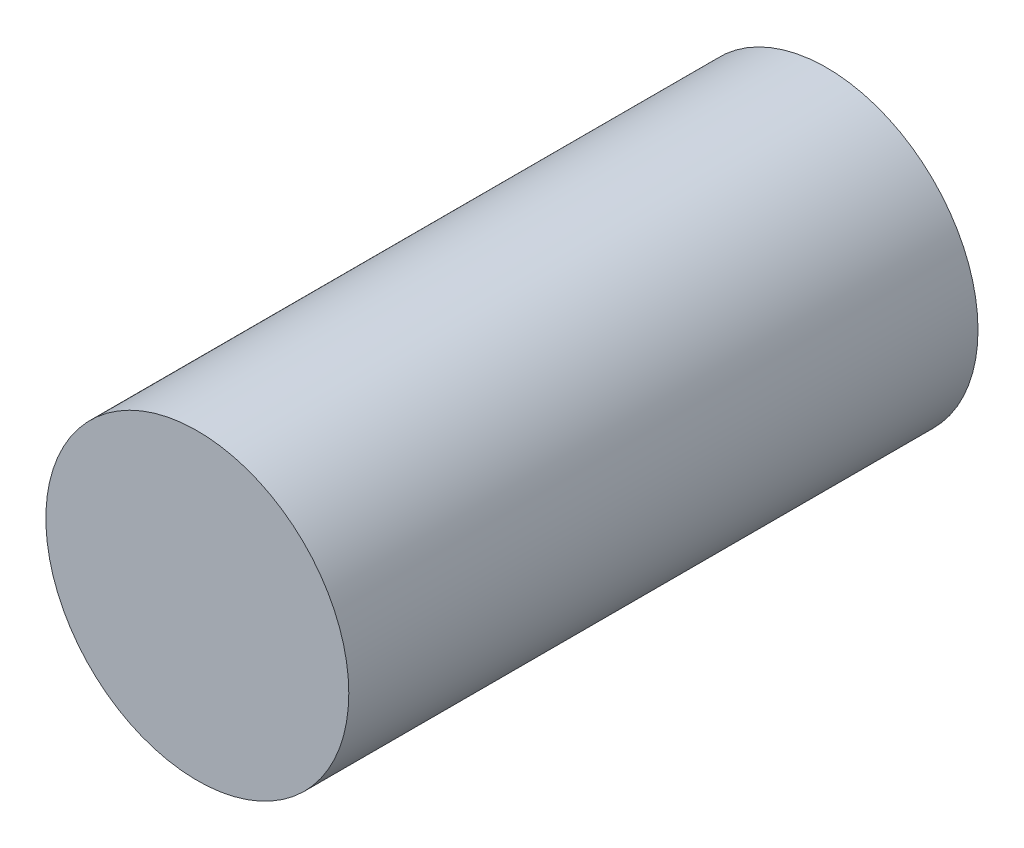
ISO-10303-21;
HEADER;
FILE_DESCRIPTION(('STEP AP214'),'2;1');
FILE_NAME('part.step','',(''),(''),'','','');
FILE_SCHEMA(('AUTOMOTIVE_DESIGN { 1 0 10303 214 1 1 1 1 }'));
ENDSEC;
DATA;
#1=APPLICATION_CONTEXT('core data for automotive mechanical design processes');
#2=APPLICATION_PROTOCOL_DEFINITION('international standard','automotive_design',2000,#1);
#3=PRODUCT_CONTEXT('',#1,'mechanical');
#4=PRODUCT('Part','Part','',(#3));
#5=PRODUCT_RELATED_PRODUCT_CATEGORY('part','',(#4));
#6=PRODUCT_DEFINITION_FORMATION('','',#4);
#7=PRODUCT_DEFINITION_CONTEXT('part definition',#1,'design');
#8=PRODUCT_DEFINITION('design','',#6,#7);
#9=PRODUCT_DEFINITION_SHAPE('','',#8);
#10=(LENGTH_UNIT() NAMED_UNIT(*) SI_UNIT(.MILLI.,.METRE.));
#11=(NAMED_UNIT(*) PLANE_ANGLE_UNIT() SI_UNIT($,.RADIAN.));
#12=(NAMED_UNIT(*) SI_UNIT($,.STERADIAN.) SOLID_ANGLE_UNIT());
#13=UNCERTAINTY_MEASURE_WITH_UNIT(LENGTH_MEASURE(1.E-05),#10,'distance_accuracy_value','');
#14=(GEOMETRIC_REPRESENTATION_CONTEXT(3) GLOBAL_UNCERTAINTY_ASSIGNED_CONTEXT((#13)) GLOBAL_UNIT_ASSIGNED_CONTEXT((#10,
#11,#12)) REPRESENTATION_CONTEXT('',''));
#15=CARTESIAN_POINT('',(0.,0.,0.));
#16=DIRECTION('',(0.,0.,1.));
#17=DIRECTION('',(1.,0.,0.));
#18=AXIS2_PLACEMENT_3D('',#15,#16,#17);
#19=CARTESIAN_POINT('',(0.,0.,27.));
#20=DIRECTION('',(0.,0.,-1.));
#21=DIRECTION('',(-1.,0.,0.));
#22=AXIS2_PLACEMENT_3D('',#19,#20,#21);
#23=CYLINDRICAL_SURFACE('',#22,6.5);
#24=CARTESIAN_POINT('',(0.,0.,27.));
#25=DIRECTION('',(0.,0.,1.));
#26=DIRECTION('',(1.,0.,0.));
#27=AXIS2_PLACEMENT_3D('',#24,#25,#26);
#28=CIRCLE('',#27,6.5);
#29=CARTESIAN_POINT('',(6.5,0.,27.));
#30=VERTEX_POINT('',#29);
#31=EDGE_CURVE('E10',#30,#30,#28,.T.);
#32=ORIENTED_EDGE('',*,*,#31,.F.);
#33=EDGE_LOOP('',(#32));
#34=FACE_BOUND('',#33,.T.);
#35=CARTESIAN_POINT('',(0.,0.,0.));
#36=DIRECTION('',(0.,0.,1.));
#37=DIRECTION('',(1.,0.,0.));
#38=AXIS2_PLACEMENT_3D('',#35,#36,#37);
#39=CIRCLE('',#38,6.5);
#40=CARTESIAN_POINT('',(6.5,0.,0.));
#41=VERTEX_POINT('',#40);
#42=EDGE_CURVE('E40',#41,#41,#39,.T.);
#43=ORIENTED_EDGE('',*,*,#42,.T.);
#44=EDGE_LOOP('',(#43));
#45=FACE_BOUND('',#44,.T.);
#46=ADVANCED_FACE('F37',(#34,#45),#23,.T.);
#47=CARTESIAN_POINT('',(0.,0.,27.));
#48=DIRECTION('',(0.,0.,1.));
#49=DIRECTION('',(1.,0.,0.));
#50=AXIS2_PLACEMENT_3D('',#47,#48,#49);
#51=PLANE('',#50);
#52=ORIENTED_EDGE('',*,*,#31,.T.);
#53=EDGE_LOOP('',(#52));
#54=FACE_BOUND('',#53,.T.);
#55=ADVANCED_FACE('F70',(#54),#51,.T.);
#56=CARTESIAN_POINT('',(0.,0.,0.));
#57=DIRECTION('',(0.,0.,1.));
#58=DIRECTION('',(1.,0.,0.));
#59=AXIS2_PLACEMENT_3D('',#56,#57,#58);
#60=PLANE('',#59);
#61=CARTESIAN_POINT('',(0.,0.,0.));
#62=DIRECTION('',(0.,0.,-1.));
#63=DIRECTION('',(-1.,0.,0.));
#64=AXIS2_PLACEMENT_3D('',#61,#62,#63);
#65=CIRCLE('',#64,1.5);
#66=CARTESIAN_POINT('',(-1.5,0.,0.));
#67=VERTEX_POINT('',#66);
#68=EDGE_CURVE('E51',#67,#67,#65,.T.);
#69=ORIENTED_EDGE('',*,*,#68,.F.);
#70=EDGE_LOOP('',(#69));
#71=FACE_BOUND('',#70,.T.);
#72=ORIENTED_EDGE('',*,*,#42,.F.);
#73=EDGE_LOOP('',(#72));
#74=FACE_BOUND('',#73,.T.);
#75=ADVANCED_FACE('F64',(#71,#74),#60,.F.);
#76=CARTESIAN_POINT('',(0.,0.,8.));
#77=DIRECTION('',(0.,0.,-1.));
#78=DIRECTION('',(-1.,0.,0.));
#79=AXIS2_PLACEMENT_3D('',#76,#77,#78);
#80=CYLINDRICAL_SURFACE('',#79,1.5);
#81=CARTESIAN_POINT('',(0.,0.,8.));
#82=DIRECTION('',(0.,0.,-1.));
#83=DIRECTION('',(-1.,0.,0.));
#84=AXIS2_PLACEMENT_3D('',#81,#82,#83);
#85=CIRCLE('',#84,1.5);
#86=CARTESIAN_POINT('',(-1.5,0.,8.));
#87=VERTEX_POINT('',#86);
#88=EDGE_CURVE('E49',#87,#87,#85,.T.);
#89=ORIENTED_EDGE('',*,*,#88,.F.);
#90=EDGE_LOOP('',(#89));
#91=FACE_BOUND('',#90,.T.);
#92=ORIENTED_EDGE('',*,*,#68,.T.);
#93=EDGE_LOOP('',(#92));
#94=FACE_BOUND('',#93,.T.);
#95=ADVANCED_FACE('F61',(#91,#94),#80,.F.);
#96=CARTESIAN_POINT('',(0.,0.,8.));
#97=DIRECTION('',(0.,0.,-1.));
#98=DIRECTION('',(-1.,0.,0.));
#99=AXIS2_PLACEMENT_3D('',#96,#97,#98);
#100=PLANE('',#99);
#101=ORIENTED_EDGE('',*,*,#88,.T.);
#102=EDGE_LOOP('',(#101));
#103=FACE_BOUND('',#102,.T.);
#104=ADVANCED_FACE('F59',(#103),#100,.T.);
#105=CLOSED_SHELL('',(#46,#55,#75,#95,#104));
#106=MANIFOLD_SOLID_BREP('B2',#105);
#107=ADVANCED_BREP_SHAPE_REPRESENTATION('',(#18,#106),#14);
#108=SHAPE_DEFINITION_REPRESENTATION(#9,#107);
ENDSEC;
END-ISO-10303-21;
